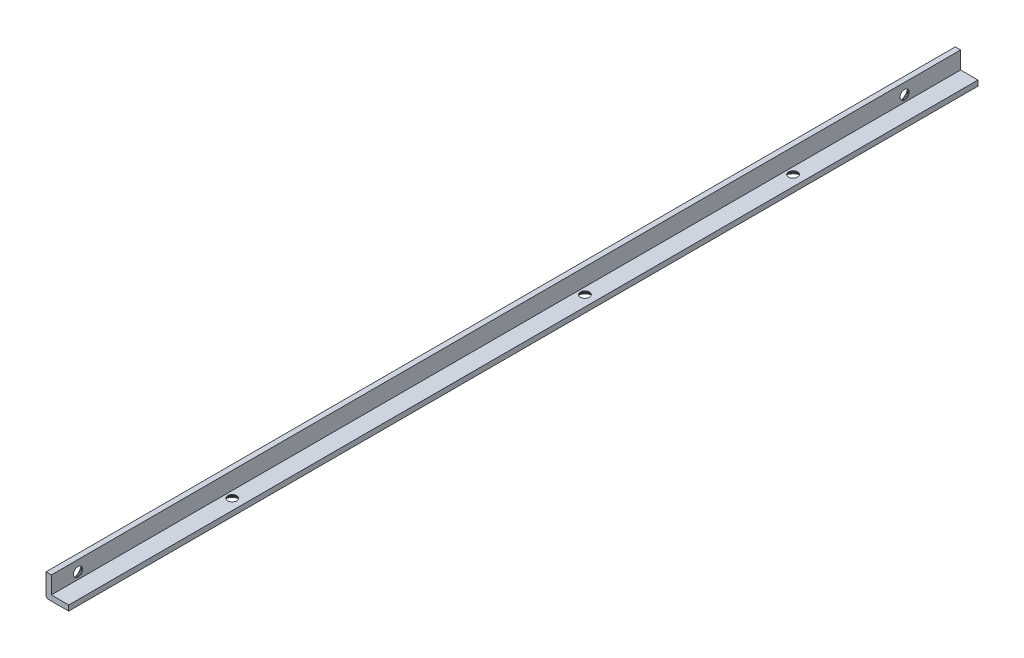
ISO-10303-21;
HEADER;
FILE_DESCRIPTION(('STEP AP214'),'2;1');
FILE_NAME('part.step','',(''),(''),'','','');
FILE_SCHEMA(('AUTOMOTIVE_DESIGN { 1 0 10303 214 1 1 1 1 }'));
ENDSEC;
DATA;
#1=APPLICATION_CONTEXT('core data for automotive mechanical design processes');
#2=APPLICATION_PROTOCOL_DEFINITION('international standard','automotive_design',2000,#1);
#3=PRODUCT_CONTEXT('',#1,'mechanical');
#4=PRODUCT('Part','Part','',(#3));
#5=PRODUCT_RELATED_PRODUCT_CATEGORY('part','',(#4));
#6=PRODUCT_DEFINITION_FORMATION('','',#4);
#7=PRODUCT_DEFINITION_CONTEXT('part definition',#1,'design');
#8=PRODUCT_DEFINITION('design','',#6,#7);
#9=PRODUCT_DEFINITION_SHAPE('','',#8);
#10=(LENGTH_UNIT() NAMED_UNIT(*) SI_UNIT(.MILLI.,.METRE.));
#11=(NAMED_UNIT(*) PLANE_ANGLE_UNIT() SI_UNIT($,.RADIAN.));
#12=(NAMED_UNIT(*) SI_UNIT($,.STERADIAN.) SOLID_ANGLE_UNIT());
#13=UNCERTAINTY_MEASURE_WITH_UNIT(LENGTH_MEASURE(1.E-05),#10,'distance_accuracy_value','');
#14=(GEOMETRIC_REPRESENTATION_CONTEXT(3) GLOBAL_UNCERTAINTY_ASSIGNED_CONTEXT((#13)) GLOBAL_UNIT_ASSIGNED_CONTEXT((#10,
#11,#12)) REPRESENTATION_CONTEXT('',''));
#15=CARTESIAN_POINT('',(0.,0.,0.));
#16=DIRECTION('',(0.,0.,1.));
#17=DIRECTION('',(1.,0.,0.));
#18=AXIS2_PLACEMENT_3D('',#15,#16,#17);
#19=CARTESIAN_POINT('',(0.,2.,340.5));
#20=DIRECTION('',(-1.,0.,0.));
#21=DIRECTION('',(0.,-1.,0.));
#22=AXIS2_PLACEMENT_3D('',#19,#20,#21);
#23=PLANE('',#22);
#24=DIRECTION('',(0.,1.,0.));
#25=VECTOR('',#24,1.);
#26=CARTESIAN_POINT('',(0.,2.,0.));
#27=LINE('',#26,#25);
#28=CARTESIAN_POINT('',(0.,0.,0.));
#29=VERTEX_POINT('',#28);
#30=CARTESIAN_POINT('',(0.,2.,0.));
#31=VERTEX_POINT('',#30);
#32=EDGE_CURVE('E121',#29,#31,#27,.T.);
#33=ORIENTED_EDGE('',*,*,#32,.T.);
#34=DIRECTION('',(0.,0.,-1.));
#35=VECTOR('',#34,1.);
#36=CARTESIAN_POINT('',(0.,2.,340.5));
#37=LINE('',#36,#35);
#38=CARTESIAN_POINT('',(0.,2.,340.5));
#39=VERTEX_POINT('',#38);
#40=EDGE_CURVE('E102',#39,#31,#37,.T.);
#41=ORIENTED_EDGE('',*,*,#40,.F.);
#42=DIRECTION('',(0.,1.,0.));
#43=VECTOR('',#42,1.);
#44=CARTESIAN_POINT('',(0.,2.,340.5));
#45=LINE('',#44,#43);
#46=CARTESIAN_POINT('',(0.,0.,340.5));
#47=VERTEX_POINT('',#46);
#48=EDGE_CURVE('E109',#47,#39,#45,.T.);
#49=ORIENTED_EDGE('',*,*,#48,.F.);
#50=DIRECTION('',(0.,0.,-1.));
#51=VECTOR('',#50,1.);
#52=CARTESIAN_POINT('',(0.,0.,340.5));
#53=LINE('',#52,#51);
#54=EDGE_CURVE('E188',#47,#29,#53,.T.);
#55=ORIENTED_EDGE('',*,*,#54,.T.);
#56=EDGE_LOOP('',(#33,#41,#49,#55));
#57=FACE_BOUND('',#56,.T.);
#58=ADVANCED_FACE('F37',(#57),#23,.F.);
#59=CARTESIAN_POINT('',(-6.5,2.,340.5));
#60=DIRECTION('',(0.,-1.,0.));
#61=DIRECTION('',(0.,0.,-1.));
#62=AXIS2_PLACEMENT_3D('',#59,#60,#61);
#63=PLANE('',#62);
#64=CARTESIAN_POINT('',(-3.99999999999999,2.,65.25));
#65=DIRECTION('',(0.,-1.,0.));
#66=DIRECTION('',(0.,0.,-1.));
#67=AXIS2_PLACEMENT_3D('',#64,#65,#66);
#68=CIRCLE('',#67,1.70000000000001);
#69=CARTESIAN_POINT('',(-3.99999999999999,2.,63.55));
#70=VERTEX_POINT('',#69);
#71=EDGE_CURVE('E145',#70,#70,#68,.T.);
#72=ORIENTED_EDGE('',*,*,#71,.T.);
#73=EDGE_LOOP('',(#72));
#74=FACE_BOUND('',#73,.T.);
#75=CARTESIAN_POINT('',(-4.,2.,143.19999924));
#76=DIRECTION('',(0.,-1.,0.));
#77=DIRECTION('',(0.,0.,-1.));
#78=AXIS2_PLACEMENT_3D('',#75,#76,#77);
#79=CIRCLE('',#78,1.70000000000001);
#80=CARTESIAN_POINT('',(-4.,2.,141.49999924));
#81=VERTEX_POINT('',#80);
#82=EDGE_CURVE('E141',#81,#81,#79,.T.);
#83=ORIENTED_EDGE('',*,*,#82,.T.);
#84=EDGE_LOOP('',(#83));
#85=FACE_BOUND('',#84,.T.);
#86=CARTESIAN_POINT('',(-4.,2.,275.25));
#87=DIRECTION('',(0.,-1.,0.));
#88=DIRECTION('',(0.,0.,-1.));
#89=AXIS2_PLACEMENT_3D('',#86,#87,#88);
#90=CIRCLE('',#89,1.70000000000001);
#91=CARTESIAN_POINT('',(-4.,2.,273.55));
#92=VERTEX_POINT('',#91);
#93=EDGE_CURVE('E136',#92,#92,#90,.T.);
#94=ORIENTED_EDGE('',*,*,#93,.T.);
#95=EDGE_LOOP('',(#94));
#96=FACE_BOUND('',#95,.T.);
#97=DIRECTION('',(-1.,0.,0.));
#98=VECTOR('',#97,1.);
#99=CARTESIAN_POINT('',(-6.5,2.,0.));
#100=LINE('',#99,#98);
#101=CARTESIAN_POINT('',(-6.5,2.,0.));
#102=VERTEX_POINT('',#101);
#103=EDGE_CURVE('E190',#31,#102,#100,.T.);
#104=ORIENTED_EDGE('',*,*,#103,.T.);
#105=DIRECTION('',(0.,0.,-1.));
#106=VECTOR('',#105,1.);
#107=CARTESIAN_POINT('',(-6.5,2.,340.5));
#108=LINE('',#107,#106);
#109=CARTESIAN_POINT('',(-6.5,2.,340.5));
#110=VERTEX_POINT('',#109);
#111=EDGE_CURVE('E105',#110,#102,#108,.T.);
#112=ORIENTED_EDGE('',*,*,#111,.F.);
#113=DIRECTION('',(-1.,0.,0.));
#114=VECTOR('',#113,1.);
#115=CARTESIAN_POINT('',(-6.5,2.,340.5));
#116=LINE('',#115,#114);
#117=EDGE_CURVE('E98',#39,#110,#116,.T.);
#118=ORIENTED_EDGE('',*,*,#117,.F.);
#119=ORIENTED_EDGE('',*,*,#40,.T.);
#120=EDGE_LOOP('',(#104,#112,#118,#119));
#121=FACE_BOUND('',#120,.T.);
#122=ADVANCED_FACE('F100',(#74,#85,#96,#121),#63,.F.);
#123=CARTESIAN_POINT('',(-6.5,8.5,340.5));
#124=DIRECTION('',(-1.,0.,0.));
#125=DIRECTION('',(0.,0.,1.));
#126=AXIS2_PLACEMENT_3D('',#123,#124,#125);
#127=PLANE('',#126);
#128=CARTESIAN_POINT('',(-6.5,4.5,21.));
#129=DIRECTION('',(-1.,0.,0.));
#130=DIRECTION('',(0.,0.,1.));
#131=AXIS2_PLACEMENT_3D('',#128,#129,#130);
#132=CIRCLE('',#131,1.70000000000001);
#133=CARTESIAN_POINT('',(-6.5,4.5,22.7));
#134=VERTEX_POINT('',#133);
#135=EDGE_CURVE('E41',#134,#134,#132,.T.);
#136=ORIENTED_EDGE('',*,*,#135,.T.);
#137=EDGE_LOOP('',(#136));
#138=FACE_BOUND('',#137,.T.);
#139=CARTESIAN_POINT('',(-6.5,4.49999999999987,330.500000000001));
#140=DIRECTION('',(-1.,0.,0.));
#141=DIRECTION('',(0.,0.,1.));
#142=AXIS2_PLACEMENT_3D('',#139,#140,#141);
#143=CIRCLE('',#142,1.70000000000001);
#144=CARTESIAN_POINT('',(-6.5,4.49999999999987,332.200000000001));
#145=VERTEX_POINT('',#144);
#146=EDGE_CURVE('E132',#145,#145,#143,.T.);
#147=ORIENTED_EDGE('',*,*,#146,.T.);
#148=EDGE_LOOP('',(#147));
#149=FACE_BOUND('',#148,.T.);
#150=DIRECTION('',(0.,1.,0.));
#151=VECTOR('',#150,1.);
#152=CARTESIAN_POINT('',(-6.5,8.5,0.));
#153=LINE('',#152,#151);
#154=CARTESIAN_POINT('',(-6.5,8.5,0.));
#155=VERTEX_POINT('',#154);
#156=EDGE_CURVE('E192',#102,#155,#153,.T.);
#157=ORIENTED_EDGE('',*,*,#156,.T.);
#158=DIRECTION('',(0.,0.,-1.));
#159=VECTOR('',#158,1.);
#160=CARTESIAN_POINT('',(-6.5,8.5,340.5));
#161=LINE('',#160,#159);
#162=CARTESIAN_POINT('',(-6.5,8.5,340.5));
#163=VERTEX_POINT('',#162);
#164=EDGE_CURVE('E126',#163,#155,#161,.T.);
#165=ORIENTED_EDGE('',*,*,#164,.F.);
#166=DIRECTION('',(0.,1.,0.));
#167=VECTOR('',#166,1.);
#168=CARTESIAN_POINT('',(-6.5,8.5,340.5));
#169=LINE('',#168,#167);
#170=EDGE_CURVE('E108',#110,#163,#169,.T.);
#171=ORIENTED_EDGE('',*,*,#170,.F.);
#172=ORIENTED_EDGE('',*,*,#111,.T.);
#173=EDGE_LOOP('',(#157,#165,#171,#172));
#174=FACE_BOUND('',#173,.T.);
#175=ADVANCED_FACE('F218',(#138,#149,#174),#127,.F.);
#176=CARTESIAN_POINT('',(-8.5,8.5,340.5));
#177=DIRECTION('',(0.,-1.,0.));
#178=DIRECTION('',(0.,0.,-1.));
#179=AXIS2_PLACEMENT_3D('',#176,#177,#178);
#180=PLANE('',#179);
#181=DIRECTION('',(-1.,0.,0.));
#182=VECTOR('',#181,1.);
#183=CARTESIAN_POINT('',(-8.5,8.5,0.));
#184=LINE('',#183,#182);
#185=CARTESIAN_POINT('',(-8.5,8.5,0.));
#186=VERTEX_POINT('',#185);
#187=EDGE_CURVE('E194',#155,#186,#184,.T.);
#188=ORIENTED_EDGE('',*,*,#187,.T.);
#189=DIRECTION('',(0.,0.,-1.));
#190=VECTOR('',#189,1.);
#191=CARTESIAN_POINT('',(-8.5,8.5,340.5));
#192=LINE('',#191,#190);
#193=CARTESIAN_POINT('',(-8.5,8.5,340.5));
#194=VERTEX_POINT('',#193);
#195=EDGE_CURVE('E200',#194,#186,#192,.T.);
#196=ORIENTED_EDGE('',*,*,#195,.F.);
#197=DIRECTION('',(-1.,0.,0.));
#198=VECTOR('',#197,1.);
#199=CARTESIAN_POINT('',(-8.5,8.5,340.5));
#200=LINE('',#199,#198);
#201=EDGE_CURVE('E183',#163,#194,#200,.T.);
#202=ORIENTED_EDGE('',*,*,#201,.F.);
#203=ORIENTED_EDGE('',*,*,#164,.T.);
#204=EDGE_LOOP('',(#188,#196,#202,#203));
#205=FACE_BOUND('',#204,.T.);
#206=ADVANCED_FACE('F207',(#205),#180,.F.);
#207=CARTESIAN_POINT('',(-8.5,0.,340.5));
#208=DIRECTION('',(1.,0.,0.));
#209=DIRECTION('',(0.,0.,-1.));
#210=AXIS2_PLACEMENT_3D('',#207,#208,#209);
#211=PLANE('',#210);
#212=CARTESIAN_POINT('',(-8.5,4.5,21.));
#213=DIRECTION('',(-1.,0.,0.));
#214=DIRECTION('',(0.,0.,1.));
#215=AXIS2_PLACEMENT_3D('',#212,#213,#214);
#216=CIRCLE('',#215,3.15);
#217=CARTESIAN_POINT('',(-8.5,4.5,24.15));
#218=VERTEX_POINT('',#217);
#219=EDGE_CURVE('E445',#218,#218,#216,.T.);
#220=ORIENTED_EDGE('',*,*,#219,.F.);
#221=EDGE_LOOP('',(#220));
#222=FACE_BOUND('',#221,.T.);
#223=CARTESIAN_POINT('',(-8.5,4.49999999999987,330.500000000001));
#224=DIRECTION('',(-1.,0.,0.));
#225=DIRECTION('',(0.,0.,1.));
#226=AXIS2_PLACEMENT_3D('',#223,#224,#225);
#227=CIRCLE('',#226,3.15);
#228=CARTESIAN_POINT('',(-8.5,4.49999999999987,333.65));
#229=VERTEX_POINT('',#228);
#230=EDGE_CURVE('E139',#229,#229,#227,.T.);
#231=ORIENTED_EDGE('',*,*,#230,.F.);
#232=EDGE_LOOP('',(#231));
#233=FACE_BOUND('',#232,.T.);
#234=DIRECTION('',(0.,-1.,0.));
#235=VECTOR('',#234,1.);
#236=CARTESIAN_POINT('',(-8.5,0.,0.));
#237=LINE('',#236,#235);
#238=CARTESIAN_POINT('',(-8.5,0.999999999999999,0.));
#239=VERTEX_POINT('',#238);
#240=EDGE_CURVE('E196',#186,#239,#237,.T.);
#241=ORIENTED_EDGE('',*,*,#240,.T.);
#242=DIRECTION('',(0.,0.,-1.));
#243=VECTOR('',#242,1.);
#244=CARTESIAN_POINT('',(-8.5,0.999999999999999,340.5));
#245=LINE('',#244,#243);
#246=CARTESIAN_POINT('',(-8.5,0.999999999999999,340.5));
#247=VERTEX_POINT('',#246);
#248=EDGE_CURVE('E46',#239,#247,#245,.F.);
#249=ORIENTED_EDGE('',*,*,#248,.T.);
#250=DIRECTION('',(0.,-1.,0.));
#251=VECTOR('',#250,1.);
#252=CARTESIAN_POINT('',(-8.5,0.,340.5));
#253=LINE('',#252,#251);
#254=EDGE_CURVE('E185',#194,#247,#253,.T.);
#255=ORIENTED_EDGE('',*,*,#254,.F.);
#256=ORIENTED_EDGE('',*,*,#195,.T.);
#257=EDGE_LOOP('',(#241,#249,#255,#256));
#258=FACE_BOUND('',#257,.T.);
#259=ADVANCED_FACE('F212',(#222,#233,#258),#211,.F.);
#260=CARTESIAN_POINT('',(0.,0.,340.5));
#261=DIRECTION('',(0.,1.,0.));
#262=DIRECTION('',(-1.,0.,0.));
#263=AXIS2_PLACEMENT_3D('',#260,#261,#262);
#264=PLANE('',#263);
#265=CARTESIAN_POINT('',(-3.99999999999999,0.,65.25));
#266=DIRECTION('',(0.,-1.,0.));
#267=DIRECTION('',(0.,0.,-1.));
#268=AXIS2_PLACEMENT_3D('',#265,#266,#267);
#269=CIRCLE('',#268,3.15);
#270=CARTESIAN_POINT('',(-3.99999999999999,0.,62.1));
#271=VERTEX_POINT('',#270);
#272=EDGE_CURVE('E160',#271,#271,#269,.T.);
#273=ORIENTED_EDGE('',*,*,#272,.F.);
#274=EDGE_LOOP('',(#273));
#275=FACE_BOUND('',#274,.T.);
#276=CARTESIAN_POINT('',(-4.,0.,143.19999924));
#277=DIRECTION('',(0.,-1.,0.));
#278=DIRECTION('',(0.,0.,-1.));
#279=AXIS2_PLACEMENT_3D('',#276,#277,#278);
#280=CIRCLE('',#279,3.15);
#281=CARTESIAN_POINT('',(-4.,0.,140.04999924));
#282=VERTEX_POINT('',#281);
#283=EDGE_CURVE('E147',#282,#282,#280,.T.);
#284=ORIENTED_EDGE('',*,*,#283,.F.);
#285=EDGE_LOOP('',(#284));
#286=FACE_BOUND('',#285,.T.);
#287=CARTESIAN_POINT('',(-4.,0.,275.25));
#288=DIRECTION('',(0.,-1.,0.));
#289=DIRECTION('',(0.,0.,-1.));
#290=AXIS2_PLACEMENT_3D('',#287,#288,#289);
#291=CIRCLE('',#290,3.15);
#292=CARTESIAN_POINT('',(-4.,0.,272.1));
#293=VERTEX_POINT('',#292);
#294=EDGE_CURVE('E143',#293,#293,#291,.T.);
#295=ORIENTED_EDGE('',*,*,#294,.F.);
#296=EDGE_LOOP('',(#295));
#297=FACE_BOUND('',#296,.T.);
#298=DIRECTION('',(1.,0.,0.));
#299=VECTOR('',#298,1.);
#300=CARTESIAN_POINT('',(0.,0.,340.5));
#301=LINE('',#300,#299);
#302=CARTESIAN_POINT('',(-7.5,0.,340.5));
#303=VERTEX_POINT('',#302);
#304=EDGE_CURVE('E114',#303,#47,#301,.T.);
#305=ORIENTED_EDGE('',*,*,#304,.F.);
#306=DIRECTION('',(0.,0.,-1.));
#307=VECTOR('',#306,1.);
#308=CARTESIAN_POINT('',(-7.5,0.,340.5));
#309=LINE('',#308,#307);
#310=CARTESIAN_POINT('',(-7.5,0.,0.));
#311=VERTEX_POINT('',#310);
#312=EDGE_CURVE('E122',#303,#311,#309,.T.);
#313=ORIENTED_EDGE('',*,*,#312,.T.);
#314=DIRECTION('',(1.,0.,0.));
#315=VECTOR('',#314,1.);
#316=CARTESIAN_POINT('',(0.,0.,0.));
#317=LINE('',#316,#315);
#318=EDGE_CURVE('E118',#311,#29,#317,.T.);
#319=ORIENTED_EDGE('',*,*,#318,.T.);
#320=ORIENTED_EDGE('',*,*,#54,.F.);
#321=EDGE_LOOP('',(#305,#313,#319,#320));
#322=FACE_BOUND('',#321,.T.);
#323=ADVANCED_FACE('F217',(#275,#286,#297,#322),#264,.F.);
#324=CARTESIAN_POINT('',(0.,0.,340.5));
#325=DIRECTION('',(0.,0.,-1.));
#326=DIRECTION('',(-1.,0.,0.));
#327=AXIS2_PLACEMENT_3D('',#324,#325,#326);
#328=PLANE('',#327);
#329=ORIENTED_EDGE('',*,*,#254,.T.);
#330=CARTESIAN_POINT('',(-7.5,0.999999999999999,340.5));
#331=DIRECTION('',(0.,0.,-1.));
#332=DIRECTION('',(-1.,0.,0.));
#333=AXIS2_PLACEMENT_3D('',#330,#331,#332);
#334=CIRCLE('',#333,1.);
#335=EDGE_CURVE('E11',#247,#303,#334,.F.);
#336=ORIENTED_EDGE('',*,*,#335,.T.);
#337=ORIENTED_EDGE('',*,*,#304,.T.);
#338=ORIENTED_EDGE('',*,*,#48,.T.);
#339=ORIENTED_EDGE('',*,*,#117,.T.);
#340=ORIENTED_EDGE('',*,*,#170,.T.);
#341=ORIENTED_EDGE('',*,*,#201,.T.);
#342=EDGE_LOOP('',(#329,#336,#337,#338,#339,#340,#341));
#343=FACE_BOUND('',#342,.T.);
#344=ADVANCED_FACE('F112',(#343),#328,.F.);
#345=CARTESIAN_POINT('',(0.,0.,0.));
#346=DIRECTION('',(0.,0.,-1.));
#347=DIRECTION('',(-1.,0.,0.));
#348=AXIS2_PLACEMENT_3D('',#345,#346,#347);
#349=PLANE('',#348);
#350=ORIENTED_EDGE('',*,*,#318,.F.);
#351=CARTESIAN_POINT('',(-7.5,0.999999999999999,0.));
#352=DIRECTION('',(0.,0.,-1.));
#353=DIRECTION('',(-1.,0.,0.));
#354=AXIS2_PLACEMENT_3D('',#351,#352,#353);
#355=CIRCLE('',#354,1.);
#356=EDGE_CURVE('E61',#311,#239,#355,.T.);
#357=ORIENTED_EDGE('',*,*,#356,.T.);
#358=ORIENTED_EDGE('',*,*,#240,.F.);
#359=ORIENTED_EDGE('',*,*,#187,.F.);
#360=ORIENTED_EDGE('',*,*,#156,.F.);
#361=ORIENTED_EDGE('',*,*,#103,.F.);
#362=ORIENTED_EDGE('',*,*,#32,.F.);
#363=EDGE_LOOP('',(#350,#357,#358,#359,#360,#361,#362));
#364=FACE_BOUND('',#363,.T.);
#365=ADVANCED_FACE('F211',(#364),#349,.T.);
#366=CARTESIAN_POINT('',(-7.5,0.999999999999999,340.5));
#367=DIRECTION('',(0.,0.,-1.));
#368=DIRECTION('',(-1.,0.,0.));
#369=AXIS2_PLACEMENT_3D('',#366,#367,#368);
#370=CYLINDRICAL_SURFACE('',#369,1.);
#371=ORIENTED_EDGE('',*,*,#335,.F.);
#372=ORIENTED_EDGE('',*,*,#248,.F.);
#373=ORIENTED_EDGE('',*,*,#356,.F.);
#374=ORIENTED_EDGE('',*,*,#312,.F.);
#375=EDGE_LOOP('',(#371,#372,#373,#374));
#376=FACE_BOUND('',#375,.T.);
#377=ADVANCED_FACE('F39',(#376),#370,.T.);
#378=CARTESIAN_POINT('',(-8.5,4.49999999999987,330.500000000001));
#379=DIRECTION('',(-1.,0.,0.));
#380=DIRECTION('',(0.,0.,1.));
#381=AXIS2_PLACEMENT_3D('',#378,#379,#380);
#382=CYLINDRICAL_SURFACE('',#381,1.70000000000001);
#383=CARTESIAN_POINT('',(-6.75000000000001,4.49999999999987,330.500000000001));
#384=DIRECTION('',(-1.,0.,0.));
#385=DIRECTION('',(0.,0.,1.));
#386=AXIS2_PLACEMENT_3D('',#383,#384,#385);
#387=CIRCLE('',#386,1.70000000000001);
#388=CARTESIAN_POINT('',(-6.75000000000001,4.49999999999987,332.200000000001));
#389=VERTEX_POINT('',#388);
#390=EDGE_CURVE('E135',#389,#389,#387,.T.);
#391=ORIENTED_EDGE('',*,*,#390,.T.);
#392=EDGE_LOOP('',(#391));
#393=FACE_BOUND('',#392,.T.);
#394=ORIENTED_EDGE('',*,*,#146,.F.);
#395=EDGE_LOOP('',(#394));
#396=FACE_BOUND('',#395,.T.);
#397=ADVANCED_FACE('F284',(#393,#396),#382,.F.);
#398=CARTESIAN_POINT('',(-8.2,4.49999999999987,330.500000000001));
#399=DIRECTION('',(-1.,0.,0.));
#400=DIRECTION('',(0.,0.,1.));
#401=AXIS2_PLACEMENT_3D('',#398,#399,#400);
#402=CONICAL_SURFACE('',#401,3.15,0.785398163397447);
#403=ORIENTED_EDGE('',*,*,#390,.F.);
#404=EDGE_LOOP('',(#403));
#405=FACE_BOUND('',#404,.T.);
#406=CARTESIAN_POINT('',(-8.2,4.49999999999987,330.500000000001));
#407=DIRECTION('',(-1.,0.,0.));
#408=DIRECTION('',(0.,0.,1.));
#409=AXIS2_PLACEMENT_3D('',#406,#407,#408);
#410=CIRCLE('',#409,3.15);
#411=CARTESIAN_POINT('',(-8.2,4.49999999999987,333.65));
#412=VERTEX_POINT('',#411);
#413=EDGE_CURVE('E177',#412,#412,#410,.T.);
#414=ORIENTED_EDGE('',*,*,#413,.T.);
#415=EDGE_LOOP('',(#414));
#416=FACE_BOUND('',#415,.T.);
#417=ADVANCED_FACE('F289',(#405,#416),#402,.F.);
#418=CARTESIAN_POINT('',(-8.5,4.49999999999987,330.500000000001));
#419=DIRECTION('',(-1.,0.,0.));
#420=DIRECTION('',(0.,0.,1.));
#421=AXIS2_PLACEMENT_3D('',#418,#419,#420);
#422=CYLINDRICAL_SURFACE('',#421,3.15);
#423=ORIENTED_EDGE('',*,*,#413,.F.);
#424=EDGE_LOOP('',(#423));
#425=FACE_BOUND('',#424,.T.);
#426=ORIENTED_EDGE('',*,*,#230,.T.);
#427=EDGE_LOOP('',(#426));
#428=FACE_BOUND('',#427,.T.);
#429=ADVANCED_FACE('F297',(#425,#428),#422,.F.);
#430=CARTESIAN_POINT('',(-4.,0.,275.25));
#431=DIRECTION('',(0.,-1.,0.));
#432=DIRECTION('',(0.,0.,-1.));
#433=AXIS2_PLACEMENT_3D('',#430,#431,#432);
#434=CYLINDRICAL_SURFACE('',#433,1.70000000000001);
#435=CARTESIAN_POINT('',(-4.,1.74999999999999,275.25));
#436=DIRECTION('',(0.,-1.,0.));
#437=DIRECTION('',(0.,0.,-1.));
#438=AXIS2_PLACEMENT_3D('',#435,#436,#437);
#439=CIRCLE('',#438,1.70000000000001);
#440=CARTESIAN_POINT('',(-4.,1.74999999999999,273.55));
#441=VERTEX_POINT('',#440);
#442=EDGE_CURVE('E140',#441,#441,#439,.T.);
#443=ORIENTED_EDGE('',*,*,#442,.T.);
#444=EDGE_LOOP('',(#443));
#445=FACE_BOUND('',#444,.T.);
#446=ORIENTED_EDGE('',*,*,#93,.F.);
#447=EDGE_LOOP('',(#446));
#448=FACE_BOUND('',#447,.T.);
#449=ADVANCED_FACE('F305',(#445,#448),#434,.F.);
#450=CARTESIAN_POINT('',(-4.,0.299999999999996,275.25));
#451=DIRECTION('',(0.,-1.,0.));
#452=DIRECTION('',(0.,0.,-1.));
#453=AXIS2_PLACEMENT_3D('',#450,#451,#452);
#454=CONICAL_SURFACE('',#453,3.15,0.785398163397447);
#455=ORIENTED_EDGE('',*,*,#442,.F.);
#456=EDGE_LOOP('',(#455));
#457=FACE_BOUND('',#456,.T.);
#458=CARTESIAN_POINT('',(-4.,0.299999999999996,275.25));
#459=DIRECTION('',(0.,-1.,0.));
#460=DIRECTION('',(0.,0.,-1.));
#461=AXIS2_PLACEMENT_3D('',#458,#459,#460);
#462=CIRCLE('',#461,3.15);
#463=CARTESIAN_POINT('',(-4.,0.299999999999996,272.1));
#464=VERTEX_POINT('',#463);
#465=EDGE_CURVE('E170',#464,#464,#462,.T.);
#466=ORIENTED_EDGE('',*,*,#465,.T.);
#467=EDGE_LOOP('',(#466));
#468=FACE_BOUND('',#467,.T.);
#469=ADVANCED_FACE('F313',(#457,#468),#454,.F.);
#470=CARTESIAN_POINT('',(-4.,0.,275.25));
#471=DIRECTION('',(0.,-1.,0.));
#472=DIRECTION('',(0.,0.,-1.));
#473=AXIS2_PLACEMENT_3D('',#470,#471,#472);
#474=CYLINDRICAL_SURFACE('',#473,3.15);
#475=ORIENTED_EDGE('',*,*,#465,.F.);
#476=EDGE_LOOP('',(#475));
#477=FACE_BOUND('',#476,.T.);
#478=ORIENTED_EDGE('',*,*,#294,.T.);
#479=EDGE_LOOP('',(#478));
#480=FACE_BOUND('',#479,.T.);
#481=ADVANCED_FACE('F321',(#477,#480),#474,.F.);
#482=CARTESIAN_POINT('',(-4.,0.,143.19999924));
#483=DIRECTION('',(0.,-1.,0.));
#484=DIRECTION('',(0.,0.,-1.));
#485=AXIS2_PLACEMENT_3D('',#482,#483,#484);
#486=CYLINDRICAL_SURFACE('',#485,1.70000000000001);
#487=CARTESIAN_POINT('',(-4.,1.74999999999999,143.19999924));
#488=DIRECTION('',(0.,-1.,0.));
#489=DIRECTION('',(0.,0.,-1.));
#490=AXIS2_PLACEMENT_3D('',#487,#488,#489);
#491=CIRCLE('',#490,1.70000000000001);
#492=CARTESIAN_POINT('',(-4.,1.74999999999999,141.49999924));
#493=VERTEX_POINT('',#492);
#494=EDGE_CURVE('E144',#493,#493,#491,.T.);
#495=ORIENTED_EDGE('',*,*,#494,.T.);
#496=EDGE_LOOP('',(#495));
#497=FACE_BOUND('',#496,.T.);
#498=ORIENTED_EDGE('',*,*,#82,.F.);
#499=EDGE_LOOP('',(#498));
#500=FACE_BOUND('',#499,.T.);
#501=ADVANCED_FACE('F329',(#497,#500),#486,.F.);
#502=CARTESIAN_POINT('',(-4.,0.299999999999996,143.19999924));
#503=DIRECTION('',(0.,-1.,0.));
#504=DIRECTION('',(0.,0.,-1.));
#505=AXIS2_PLACEMENT_3D('',#502,#503,#504);
#506=CONICAL_SURFACE('',#505,3.15,0.785398163397447);
#507=ORIENTED_EDGE('',*,*,#494,.F.);
#508=EDGE_LOOP('',(#507));
#509=FACE_BOUND('',#508,.T.);
#510=CARTESIAN_POINT('',(-4.,0.299999999999996,143.19999924));
#511=DIRECTION('',(0.,-1.,0.));
#512=DIRECTION('',(0.,0.,-1.));
#513=AXIS2_PLACEMENT_3D('',#510,#511,#512);
#514=CIRCLE('',#513,3.15);
#515=CARTESIAN_POINT('',(-4.,0.299999999999996,140.04999924));
#516=VERTEX_POINT('',#515);
#517=EDGE_CURVE('E152',#516,#516,#514,.T.);
#518=ORIENTED_EDGE('',*,*,#517,.T.);
#519=EDGE_LOOP('',(#518));
#520=FACE_BOUND('',#519,.T.);
#521=ADVANCED_FACE('F337',(#509,#520),#506,.F.);
#522=CARTESIAN_POINT('',(-4.,0.,143.19999924));
#523=DIRECTION('',(0.,-1.,0.));
#524=DIRECTION('',(0.,0.,-1.));
#525=AXIS2_PLACEMENT_3D('',#522,#523,#524);
#526=CYLINDRICAL_SURFACE('',#525,3.15);
#527=ORIENTED_EDGE('',*,*,#517,.F.);
#528=EDGE_LOOP('',(#527));
#529=FACE_BOUND('',#528,.T.);
#530=ORIENTED_EDGE('',*,*,#283,.T.);
#531=EDGE_LOOP('',(#530));
#532=FACE_BOUND('',#531,.T.);
#533=ADVANCED_FACE('F345',(#529,#532),#526,.F.);
#534=CARTESIAN_POINT('',(-3.99999999999999,0.,65.25));
#535=DIRECTION('',(0.,-1.,0.));
#536=DIRECTION('',(0.,0.,-1.));
#537=AXIS2_PLACEMENT_3D('',#534,#535,#536);
#538=CYLINDRICAL_SURFACE('',#537,1.70000000000001);
#539=CARTESIAN_POINT('',(-3.99999999999999,1.74999999999999,65.25));
#540=DIRECTION('',(0.,-1.,0.));
#541=DIRECTION('',(0.,0.,-1.));
#542=AXIS2_PLACEMENT_3D('',#539,#540,#541);
#543=CIRCLE('',#542,1.70000000000001);
#544=CARTESIAN_POINT('',(-3.99999999999999,1.74999999999999,63.55));
#545=VERTEX_POINT('',#544);
#546=EDGE_CURVE('E148',#545,#545,#543,.T.);
#547=ORIENTED_EDGE('',*,*,#546,.T.);
#548=EDGE_LOOP('',(#547));
#549=FACE_BOUND('',#548,.T.);
#550=ORIENTED_EDGE('',*,*,#71,.F.);
#551=EDGE_LOOP('',(#550));
#552=FACE_BOUND('',#551,.T.);
#553=ADVANCED_FACE('F353',(#549,#552),#538,.F.);
#554=CARTESIAN_POINT('',(-3.99999999999999,0.299999999999996,65.25));
#555=DIRECTION('',(0.,-1.,0.));
#556=DIRECTION('',(0.,0.,-1.));
#557=AXIS2_PLACEMENT_3D('',#554,#555,#556);
#558=CONICAL_SURFACE('',#557,3.15,0.785398163397447);
#559=ORIENTED_EDGE('',*,*,#546,.F.);
#560=EDGE_LOOP('',(#559));
#561=FACE_BOUND('',#560,.T.);
#562=CARTESIAN_POINT('',(-3.99999999999999,0.299999999999996,65.25));
#563=DIRECTION('',(0.,-1.,0.));
#564=DIRECTION('',(0.,0.,-1.));
#565=AXIS2_PLACEMENT_3D('',#562,#563,#564);
#566=CIRCLE('',#565,3.15);
#567=CARTESIAN_POINT('',(-3.99999999999999,0.299999999999996,62.1));
#568=VERTEX_POINT('',#567);
#569=EDGE_CURVE('E155',#568,#568,#566,.T.);
#570=ORIENTED_EDGE('',*,*,#569,.T.);
#571=EDGE_LOOP('',(#570));
#572=FACE_BOUND('',#571,.T.);
#573=ADVANCED_FACE('F361',(#561,#572),#558,.F.);
#574=CARTESIAN_POINT('',(-3.99999999999999,0.,65.25));
#575=DIRECTION('',(0.,-1.,0.));
#576=DIRECTION('',(0.,0.,-1.));
#577=AXIS2_PLACEMENT_3D('',#574,#575,#576);
#578=CYLINDRICAL_SURFACE('',#577,3.15);
#579=ORIENTED_EDGE('',*,*,#569,.F.);
#580=EDGE_LOOP('',(#579));
#581=FACE_BOUND('',#580,.T.);
#582=ORIENTED_EDGE('',*,*,#272,.T.);
#583=EDGE_LOOP('',(#582));
#584=FACE_BOUND('',#583,.T.);
#585=ADVANCED_FACE('F368',(#581,#584),#578,.F.);
#586=CARTESIAN_POINT('',(-8.5,4.5,21.));
#587=DIRECTION('',(-1.,0.,0.));
#588=DIRECTION('',(0.,0.,1.));
#589=AXIS2_PLACEMENT_3D('',#586,#587,#588);
#590=CYLINDRICAL_SURFACE('',#589,1.70000000000001);
#591=CARTESIAN_POINT('',(-6.75000000000001,4.5,21.));
#592=DIRECTION('',(-1.,0.,0.));
#593=DIRECTION('',(0.,0.,1.));
#594=AXIS2_PLACEMENT_3D('',#591,#592,#593);
#595=CIRCLE('',#594,1.70000000000001);
#596=CARTESIAN_POINT('',(-6.75000000000001,4.5,22.7));
#597=VERTEX_POINT('',#596);
#598=EDGE_CURVE('E447',#597,#597,#595,.T.);
#599=ORIENTED_EDGE('',*,*,#598,.T.);
#600=EDGE_LOOP('',(#599));
#601=FACE_BOUND('',#600,.T.);
#602=ORIENTED_EDGE('',*,*,#135,.F.);
#603=EDGE_LOOP('',(#602));
#604=FACE_BOUND('',#603,.T.);
#605=ADVANCED_FACE('F376',(#601,#604),#590,.F.);
#606=CARTESIAN_POINT('',(-8.2,4.5,21.));
#607=DIRECTION('',(-1.,0.,0.));
#608=DIRECTION('',(0.,0.,1.));
#609=AXIS2_PLACEMENT_3D('',#606,#607,#608);
#610=CONICAL_SURFACE('',#609,3.15,0.785398163397447);
#611=ORIENTED_EDGE('',*,*,#598,.F.);
#612=EDGE_LOOP('',(#611));
#613=FACE_BOUND('',#612,.T.);
#614=CARTESIAN_POINT('',(-8.2,4.5,21.));
#615=DIRECTION('',(-1.,0.,0.));
#616=DIRECTION('',(0.,0.,1.));
#617=AXIS2_PLACEMENT_3D('',#614,#615,#616);
#618=CIRCLE('',#617,3.15);
#619=CARTESIAN_POINT('',(-8.2,4.5,24.15));
#620=VERTEX_POINT('',#619);
#621=EDGE_CURVE('E442',#620,#620,#618,.T.);
#622=ORIENTED_EDGE('',*,*,#621,.T.);
#623=EDGE_LOOP('',(#622));
#624=FACE_BOUND('',#623,.T.);
#625=ADVANCED_FACE('F384',(#613,#624),#610,.F.);
#626=CARTESIAN_POINT('',(-8.5,4.5,21.));
#627=DIRECTION('',(-1.,0.,0.));
#628=DIRECTION('',(0.,0.,1.));
#629=AXIS2_PLACEMENT_3D('',#626,#627,#628);
#630=CYLINDRICAL_SURFACE('',#629,3.15);
#631=ORIENTED_EDGE('',*,*,#621,.F.);
#632=EDGE_LOOP('',(#631));
#633=FACE_BOUND('',#632,.T.);
#634=ORIENTED_EDGE('',*,*,#219,.T.);
#635=EDGE_LOOP('',(#634));
#636=FACE_BOUND('',#635,.T.);
#637=ADVANCED_FACE('F392',(#633,#636),#630,.F.);
#638=CLOSED_SHELL('',(#58,#122,#175,#206,#259,#323,#344,#365,#377,#397,#417,#429,#449,#469,#481,
#501,#521,#533,#553,#573,#585,#605,#625,#637));
#639=MANIFOLD_SOLID_BREP('B2',#638);
#640=ADVANCED_BREP_SHAPE_REPRESENTATION('',(#18,#639),#14);
#641=SHAPE_DEFINITION_REPRESENTATION(#9,#640);
ENDSEC;
END-ISO-10303-21;
